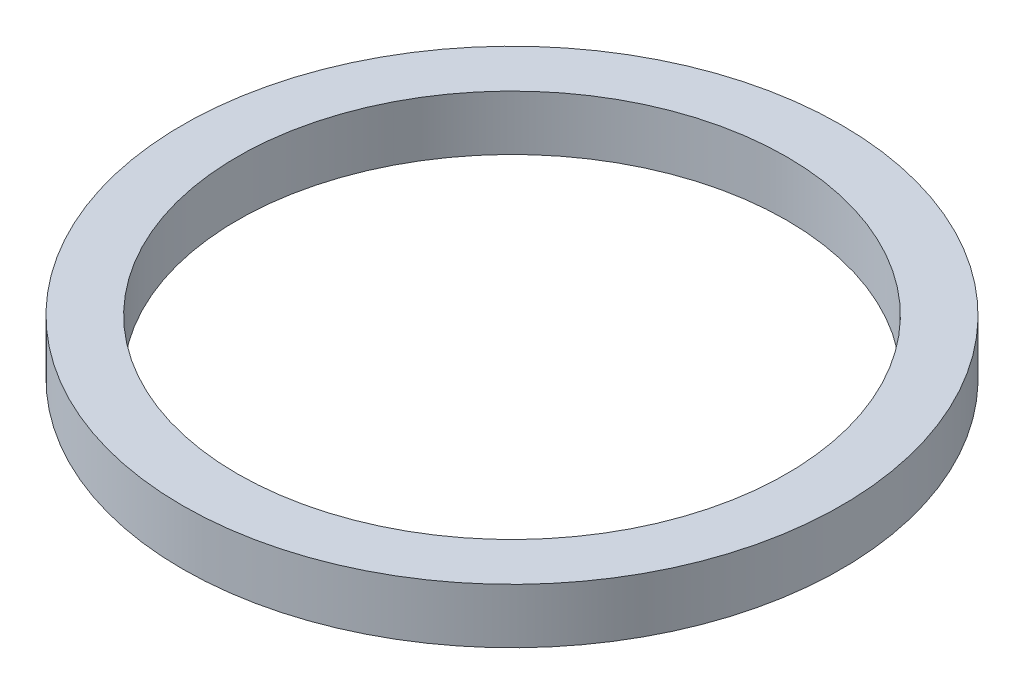
ISO-10303-21;
HEADER;
FILE_DESCRIPTION(('STEP AP214'),'2;1');
FILE_NAME('part.step','',(''),(''),'','','');
FILE_SCHEMA(('AUTOMOTIVE_DESIGN { 1 0 10303 214 1 1 1 1 }'));
ENDSEC;
DATA;
#1=APPLICATION_CONTEXT('core data for automotive mechanical design processes');
#2=APPLICATION_PROTOCOL_DEFINITION('international standard','automotive_design',2000,#1);
#3=PRODUCT_CONTEXT('',#1,'mechanical');
#4=PRODUCT('Part','Part','',(#3));
#5=PRODUCT_RELATED_PRODUCT_CATEGORY('part','',(#4));
#6=PRODUCT_DEFINITION_FORMATION('','',#4);
#7=PRODUCT_DEFINITION_CONTEXT('part definition',#1,'design');
#8=PRODUCT_DEFINITION('design','',#6,#7);
#9=PRODUCT_DEFINITION_SHAPE('','',#8);
#10=(LENGTH_UNIT() NAMED_UNIT(*) SI_UNIT(.MILLI.,.METRE.));
#11=(NAMED_UNIT(*) PLANE_ANGLE_UNIT() SI_UNIT($,.RADIAN.));
#12=(NAMED_UNIT(*) SI_UNIT($,.STERADIAN.) SOLID_ANGLE_UNIT());
#13=UNCERTAINTY_MEASURE_WITH_UNIT(LENGTH_MEASURE(1.E-05),#10,'distance_accuracy_value','');
#14=(GEOMETRIC_REPRESENTATION_CONTEXT(3) GLOBAL_UNCERTAINTY_ASSIGNED_CONTEXT((#13)) GLOBAL_UNIT_ASSIGNED_CONTEXT((#10,
#11,#12)) REPRESENTATION_CONTEXT('',''));
#15=CARTESIAN_POINT('',(0.,0.,0.));
#16=DIRECTION('',(0.,0.,1.));
#17=DIRECTION('',(1.,0.,0.));
#18=AXIS2_PLACEMENT_3D('',#15,#16,#17);
#19=CARTESIAN_POINT('',(0.,-0.05,0.));
#20=DIRECTION('',(0.,1.,0.));
#21=DIRECTION('',(0.,0.,1.));
#22=AXIS2_PLACEMENT_3D('',#19,#20,#21);
#23=CYLINDRICAL_SURFACE('',#22,0.6);
#24=CARTESIAN_POINT('',(0.,-0.05,0.));
#25=DIRECTION('',(0.,1.,0.));
#26=DIRECTION('',(0.,0.,1.));
#27=AXIS2_PLACEMENT_3D('',#24,#25,#26);
#28=CIRCLE('',#27,0.6);
#29=CARTESIAN_POINT('',(0.,-0.05,0.6));
#30=VERTEX_POINT('',#29);
#31=EDGE_CURVE('E10',#30,#30,#28,.T.);
#32=ORIENTED_EDGE('',*,*,#31,.T.);
#33=EDGE_LOOP('',(#32));
#34=FACE_BOUND('',#33,.T.);
#35=CARTESIAN_POINT('',(0.,0.05,0.));
#36=DIRECTION('',(0.,1.,0.));
#37=DIRECTION('',(0.,0.,1.));
#38=AXIS2_PLACEMENT_3D('',#35,#36,#37);
#39=CIRCLE('',#38,0.6);
#40=CARTESIAN_POINT('',(0.,0.05,0.6));
#41=VERTEX_POINT('',#40);
#42=EDGE_CURVE('E49',#41,#41,#39,.T.);
#43=ORIENTED_EDGE('',*,*,#42,.F.);
#44=EDGE_LOOP('',(#43));
#45=FACE_BOUND('',#44,.T.);
#46=ADVANCED_FACE('F37',(#34,#45),#23,.T.);
#47=CARTESIAN_POINT('',(0.,-0.05,0.));
#48=DIRECTION('',(0.,1.,0.));
#49=DIRECTION('',(0.,0.,1.));
#50=AXIS2_PLACEMENT_3D('',#47,#48,#49);
#51=PLANE('',#50);
#52=CARTESIAN_POINT('',(0.,-0.05,0.));
#53=DIRECTION('',(0.,1.,0.));
#54=DIRECTION('',(0.,0.,1.));
#55=AXIS2_PLACEMENT_3D('',#52,#53,#54);
#56=CIRCLE('',#55,0.5);
#57=CARTESIAN_POINT('',(0.,-0.05,0.5));
#58=VERTEX_POINT('',#57);
#59=EDGE_CURVE('E44',#58,#58,#56,.T.);
#60=ORIENTED_EDGE('',*,*,#59,.T.);
#61=EDGE_LOOP('',(#60));
#62=FACE_BOUND('',#61,.T.);
#63=ORIENTED_EDGE('',*,*,#31,.F.);
#64=EDGE_LOOP('',(#63));
#65=FACE_BOUND('',#64,.T.);
#66=ADVANCED_FACE('F70',(#62,#65),#51,.F.);
#67=CARTESIAN_POINT('',(0.,-0.05,0.));
#68=DIRECTION('',(0.,1.,0.));
#69=DIRECTION('',(0.,0.,1.));
#70=AXIS2_PLACEMENT_3D('',#67,#68,#69);
#71=CYLINDRICAL_SURFACE('',#70,0.5);
#72=ORIENTED_EDGE('',*,*,#59,.F.);
#73=EDGE_LOOP('',(#72));
#74=FACE_BOUND('',#73,.T.);
#75=CARTESIAN_POINT('',(0.,0.05,0.));
#76=DIRECTION('',(0.,1.,0.));
#77=DIRECTION('',(0.,0.,1.));
#78=AXIS2_PLACEMENT_3D('',#75,#76,#77);
#79=CIRCLE('',#78,0.5);
#80=CARTESIAN_POINT('',(0.,0.05,0.5));
#81=VERTEX_POINT('',#80);
#82=EDGE_CURVE('E54',#81,#81,#79,.T.);
#83=ORIENTED_EDGE('',*,*,#82,.T.);
#84=EDGE_LOOP('',(#83));
#85=FACE_BOUND('',#84,.T.);
#86=ADVANCED_FACE('F61',(#74,#85),#71,.F.);
#87=CARTESIAN_POINT('',(0.,0.05,0.));
#88=DIRECTION('',(0.,1.,0.));
#89=DIRECTION('',(0.,0.,1.));
#90=AXIS2_PLACEMENT_3D('',#87,#88,#89);
#91=PLANE('',#90);
#92=ORIENTED_EDGE('',*,*,#42,.T.);
#93=EDGE_LOOP('',(#92));
#94=FACE_BOUND('',#93,.T.);
#95=ORIENTED_EDGE('',*,*,#82,.F.);
#96=EDGE_LOOP('',(#95));
#97=FACE_BOUND('',#96,.T.);
#98=ADVANCED_FACE('F63',(#94,#97),#91,.T.);
#99=CLOSED_SHELL('',(#46,#66,#86,#98));
#100=MANIFOLD_SOLID_BREP('B2',#99);
#101=ADVANCED_BREP_SHAPE_REPRESENTATION('',(#18,#100),#14);
#102=SHAPE_DEFINITION_REPRESENTATION(#9,#101);
ENDSEC;
END-ISO-10303-21;
